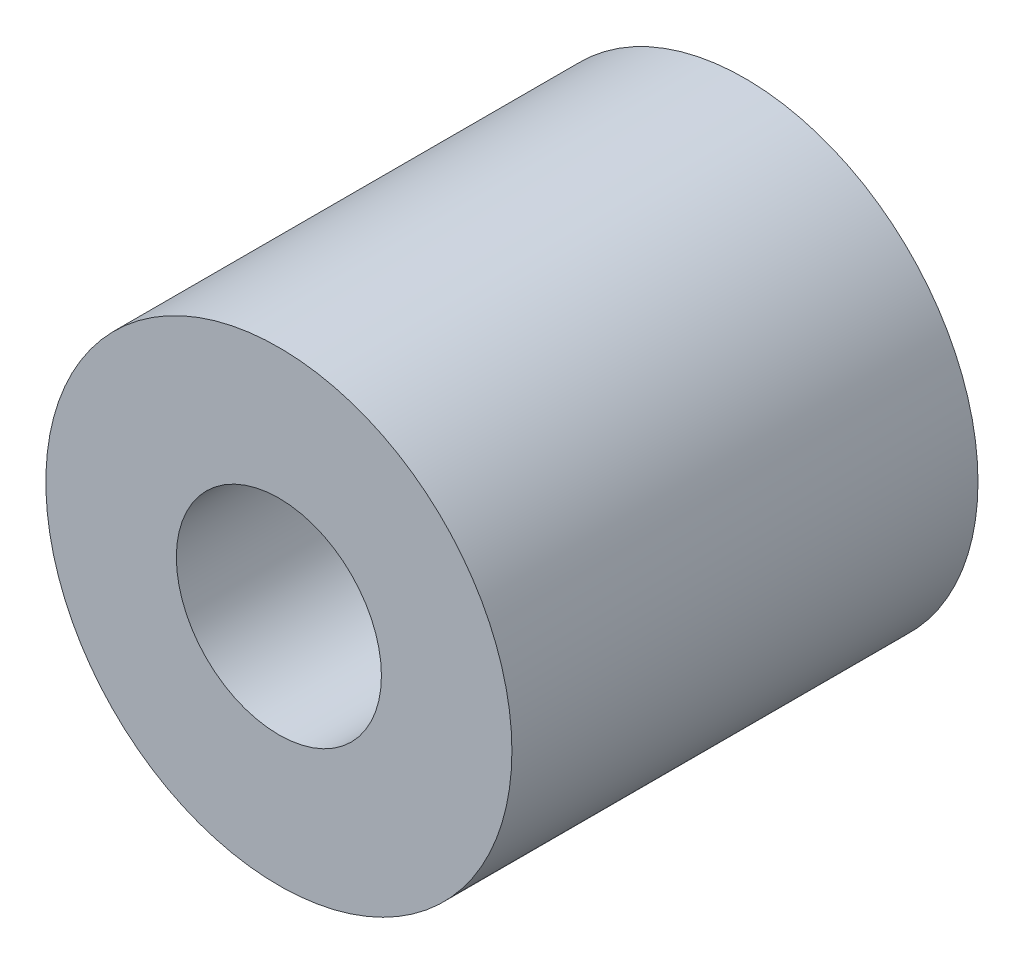
ISO-10303-21;
HEADER;
FILE_DESCRIPTION(('STEP AP214'),'2;1');
FILE_NAME('part.step','',(''),(''),'','','');
FILE_SCHEMA(('AUTOMOTIVE_DESIGN { 1 0 10303 214 1 1 1 1 }'));
ENDSEC;
DATA;
#1=APPLICATION_CONTEXT('core data for automotive mechanical design processes');
#2=APPLICATION_PROTOCOL_DEFINITION('international standard','automotive_design',2000,#1);
#3=PRODUCT_CONTEXT('',#1,'mechanical');
#4=PRODUCT('Part','Part','',(#3));
#5=PRODUCT_RELATED_PRODUCT_CATEGORY('part','',(#4));
#6=PRODUCT_DEFINITION_FORMATION('','',#4);
#7=PRODUCT_DEFINITION_CONTEXT('part definition',#1,'design');
#8=PRODUCT_DEFINITION('design','',#6,#7);
#9=PRODUCT_DEFINITION_SHAPE('','',#8);
#10=(LENGTH_UNIT() NAMED_UNIT(*) SI_UNIT(.MILLI.,.METRE.));
#11=(NAMED_UNIT(*) PLANE_ANGLE_UNIT() SI_UNIT($,.RADIAN.));
#12=(NAMED_UNIT(*) SI_UNIT($,.STERADIAN.) SOLID_ANGLE_UNIT());
#13=UNCERTAINTY_MEASURE_WITH_UNIT(LENGTH_MEASURE(1.E-05),#10,'distance_accuracy_value','');
#14=(GEOMETRIC_REPRESENTATION_CONTEXT(3) GLOBAL_UNCERTAINTY_ASSIGNED_CONTEXT((#13)) GLOBAL_UNIT_ASSIGNED_CONTEXT((#10,
#11,#12)) REPRESENTATION_CONTEXT('',''));
#15=CARTESIAN_POINT('',(0.,0.,0.));
#16=DIRECTION('',(0.,0.,1.));
#17=DIRECTION('',(1.,0.,0.));
#18=AXIS2_PLACEMENT_3D('',#15,#16,#17);
#19=CARTESIAN_POINT('',(-57.2916512459885,-7.,-41.));
#20=DIRECTION('',(0.,0.,1.));
#21=DIRECTION('',(1.,0.,0.));
#22=AXIS2_PLACEMENT_3D('',#19,#20,#21);
#23=PLANE('',#22);
#24=CARTESIAN_POINT('',(-57.2916512459885,-7.,-41.));
#25=DIRECTION('',(0.,0.,1.));
#26=DIRECTION('',(1.,0.,0.));
#27=AXIS2_PLACEMENT_3D('',#24,#25,#26);
#28=CIRCLE('',#27,5.);
#29=CARTESIAN_POINT('',(-52.2916512459885,-7.,-41.));
#30=VERTEX_POINT('',#29);
#31=EDGE_CURVE('E10',#30,#30,#28,.T.);
#32=ORIENTED_EDGE('',*,*,#31,.T.);
#33=EDGE_LOOP('',(#32));
#34=FACE_BOUND('',#33,.T.);
#35=CARTESIAN_POINT('',(-57.2916512459885,-7.,-41.));
#36=DIRECTION('',(0.,0.,1.));
#37=DIRECTION('',(1.,0.,0.));
#38=AXIS2_PLACEMENT_3D('',#35,#36,#37);
#39=CIRCLE('',#38,2.2);
#40=CARTESIAN_POINT('',(-55.0916512459885,-7.,-41.));
#41=VERTEX_POINT('',#40);
#42=EDGE_CURVE('E49',#41,#41,#39,.T.);
#43=ORIENTED_EDGE('',*,*,#42,.F.);
#44=EDGE_LOOP('',(#43));
#45=FACE_BOUND('',#44,.T.);
#46=ADVANCED_FACE('F39',(#34,#45),#23,.T.);
#47=CARTESIAN_POINT('',(-57.2916512459885,-7.,-51.));
#48=DIRECTION('',(0.,0.,1.));
#49=DIRECTION('',(1.,0.,0.));
#50=AXIS2_PLACEMENT_3D('',#47,#48,#49);
#51=PLANE('',#50);
#52=CARTESIAN_POINT('',(-57.2916512459885,-7.,-51.));
#53=DIRECTION('',(0.,0.,1.));
#54=DIRECTION('',(1.,0.,0.));
#55=AXIS2_PLACEMENT_3D('',#52,#53,#54);
#56=CIRCLE('',#55,5.);
#57=CARTESIAN_POINT('',(-52.2916512459885,-7.,-51.));
#58=VERTEX_POINT('',#57);
#59=EDGE_CURVE('E43',#58,#58,#56,.T.);
#60=ORIENTED_EDGE('',*,*,#59,.F.);
#61=EDGE_LOOP('',(#60));
#62=FACE_BOUND('',#61,.T.);
#63=CARTESIAN_POINT('',(-57.2916512459885,-7.,-51.));
#64=DIRECTION('',(0.,0.,1.));
#65=DIRECTION('',(1.,0.,0.));
#66=AXIS2_PLACEMENT_3D('',#63,#64,#65);
#67=CIRCLE('',#66,2.2);
#68=CARTESIAN_POINT('',(-55.0916512459885,-7.,-51.));
#69=VERTEX_POINT('',#68);
#70=EDGE_CURVE('E55',#69,#69,#67,.T.);
#71=ORIENTED_EDGE('',*,*,#70,.T.);
#72=EDGE_LOOP('',(#71));
#73=FACE_BOUND('',#72,.T.);
#74=ADVANCED_FACE('F61',(#62,#73),#51,.F.);
#75=CARTESIAN_POINT('',(-57.2916512459885,-7.,-41.));
#76=DIRECTION('',(0.,0.,-1.));
#77=DIRECTION('',(-1.,0.,0.));
#78=AXIS2_PLACEMENT_3D('',#75,#76,#77);
#79=CYLINDRICAL_SURFACE('',#78,5.);
#80=ORIENTED_EDGE('',*,*,#31,.F.);
#81=EDGE_LOOP('',(#80));
#82=FACE_BOUND('',#81,.T.);
#83=ORIENTED_EDGE('',*,*,#59,.T.);
#84=EDGE_LOOP('',(#83));
#85=FACE_BOUND('',#84,.T.);
#86=ADVANCED_FACE('F41',(#82,#85),#79,.T.);
#87=CARTESIAN_POINT('',(-57.2916512459885,-7.,-41.));
#88=DIRECTION('',(0.,0.,-1.));
#89=DIRECTION('',(-1.,0.,0.));
#90=AXIS2_PLACEMENT_3D('',#87,#88,#89);
#91=CYLINDRICAL_SURFACE('',#90,2.2);
#92=ORIENTED_EDGE('',*,*,#42,.T.);
#93=EDGE_LOOP('',(#92));
#94=FACE_BOUND('',#93,.T.);
#95=ORIENTED_EDGE('',*,*,#70,.F.);
#96=EDGE_LOOP('',(#95));
#97=FACE_BOUND('',#96,.T.);
#98=ADVANCED_FACE('F59',(#94,#97),#91,.F.);
#99=CLOSED_SHELL('',(#46,#74,#86,#98));
#100=MANIFOLD_SOLID_BREP('B2',#99);
#101=ADVANCED_BREP_SHAPE_REPRESENTATION('',(#18,#100),#14);
#102=SHAPE_DEFINITION_REPRESENTATION(#9,#101);
ENDSEC;
END-ISO-10303-21;
